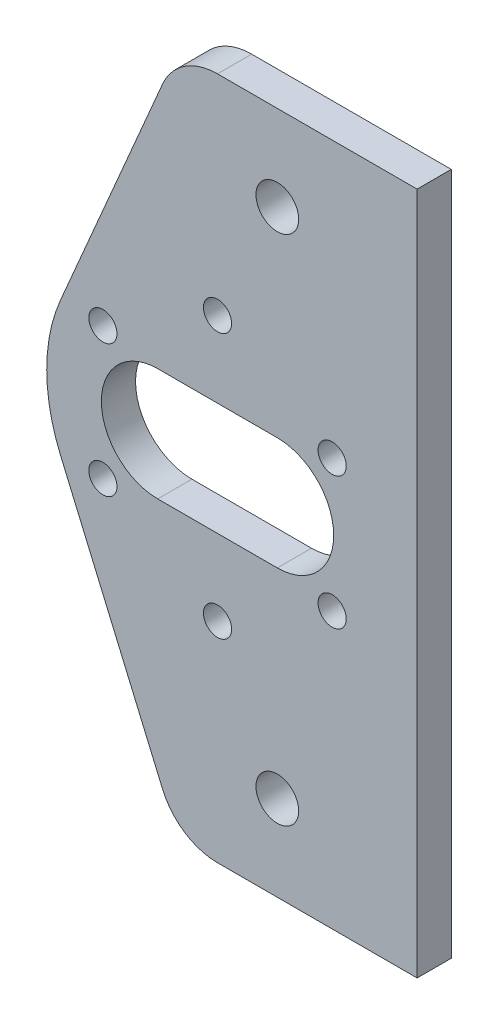
ISO-10303-21;
HEADER;
FILE_DESCRIPTION(('STEP AP214'),'2;1');
FILE_NAME('part.step','',(''),(''),'','','');
FILE_SCHEMA(('AUTOMOTIVE_DESIGN { 1 0 10303 214 1 1 1 1 }'));
ENDSEC;
DATA;
#1=APPLICATION_CONTEXT('core data for automotive mechanical design processes');
#2=APPLICATION_PROTOCOL_DEFINITION('international standard','automotive_design',2000,#1);
#3=PRODUCT_CONTEXT('',#1,'mechanical');
#4=PRODUCT('Part','Part','',(#3));
#5=PRODUCT_RELATED_PRODUCT_CATEGORY('part','',(#4));
#6=PRODUCT_DEFINITION_FORMATION('','',#4);
#7=PRODUCT_DEFINITION_CONTEXT('part definition',#1,'design');
#8=PRODUCT_DEFINITION('design','',#6,#7);
#9=PRODUCT_DEFINITION_SHAPE('','',#8);
#10=(LENGTH_UNIT() NAMED_UNIT(*) SI_UNIT(.MILLI.,.METRE.));
#11=(NAMED_UNIT(*) PLANE_ANGLE_UNIT() SI_UNIT($,.RADIAN.));
#12=(NAMED_UNIT(*) SI_UNIT($,.STERADIAN.) SOLID_ANGLE_UNIT());
#13=UNCERTAINTY_MEASURE_WITH_UNIT(LENGTH_MEASURE(1.E-05),#10,'distance_accuracy_value','');
#14=(GEOMETRIC_REPRESENTATION_CONTEXT(3) GLOBAL_UNCERTAINTY_ASSIGNED_CONTEXT((#13)) GLOBAL_UNIT_ASSIGNED_CONTEXT((#10,
#11,#12)) REPRESENTATION_CONTEXT('',''));
#15=CARTESIAN_POINT('',(0.,0.,0.));
#16=DIRECTION('',(0.,0.,1.));
#17=DIRECTION('',(1.,0.,0.));
#18=AXIS2_PLACEMENT_3D('',#15,#16,#17);
#19=CARTESIAN_POINT('',(-23.37,33.,2.));
#20=DIRECTION('',(0.,0.,-1.));
#21=DIRECTION('',(-1.,0.,0.));
#22=AXIS2_PLACEMENT_3D('',#19,#20,#21);
#23=PLANE('',#22);
#24=CARTESIAN_POINT('',(-9.94660624134121,7.75,2.));
#25=DIRECTION('',(0.,0.,1.));
#26=DIRECTION('',(1.,0.,0.));
#27=AXIS2_PLACEMENT_3D('',#24,#25,#26);
#28=CIRCLE('',#27,1.65000000000002);
#29=CARTESIAN_POINT('',(-8.29660624134119,7.75,2.));
#30=VERTEX_POINT('',#29);
#31=EDGE_CURVE('E344',#30,#30,#28,.T.);
#32=ORIENTED_EDGE('',*,*,#31,.F.);
#33=EDGE_LOOP('',(#32));
#34=FACE_BOUND('',#33,.T.);
#35=CARTESIAN_POINT('',(-30.37,0.,2.));
#36=DIRECTION('',(0.,0.,1.));
#37=DIRECTION('',(1.,0.,0.));
#38=AXIS2_PLACEMENT_3D('',#35,#36,#37);
#39=CIRCLE('',#38,6.59999999999999);
#40=CARTESIAN_POINT('',(-30.37,6.59999999999999,2.));
#41=VERTEX_POINT('',#40);
#42=CARTESIAN_POINT('',(-30.37,-6.59999999999999,2.));
#43=VERTEX_POINT('',#42);
#44=EDGE_CURVE('E128',#41,#43,#39,.T.);
#45=ORIENTED_EDGE('',*,*,#44,.F.);
#46=DIRECTION('',(-1.,0.,0.));
#47=VECTOR('',#46,1.);
#48=CARTESIAN_POINT('',(-30.37,6.59999999999999,2.));
#49=LINE('',#48,#47);
#50=CARTESIAN_POINT('',(-16.37,6.59999999999999,2.));
#51=VERTEX_POINT('',#50);
#52=EDGE_CURVE('E151',#51,#41,#49,.T.);
#53=ORIENTED_EDGE('',*,*,#52,.F.);
#54=CARTESIAN_POINT('',(-16.37,0.,2.));
#55=DIRECTION('',(0.,0.,1.));
#56=DIRECTION('',(1.,0.,0.));
#57=AXIS2_PLACEMENT_3D('',#54,#55,#56);
#58=CIRCLE('',#57,6.59999999999999);
#59=CARTESIAN_POINT('',(-16.37,-6.59999999999999,2.));
#60=VERTEX_POINT('',#59);
#61=EDGE_CURVE('E149',#60,#51,#58,.T.);
#62=ORIENTED_EDGE('',*,*,#61,.F.);
#63=DIRECTION('',(1.,0.,0.));
#64=VECTOR('',#63,1.);
#65=CARTESIAN_POINT('',(-30.37,-6.59999999999999,2.));
#66=LINE('',#65,#64);
#67=EDGE_CURVE('E136',#43,#60,#66,.T.);
#68=ORIENTED_EDGE('',*,*,#67,.F.);
#69=EDGE_LOOP('',(#45,#53,#62,#68));
#70=FACE_BOUND('',#69,.T.);
#71=CARTESIAN_POINT('',(-36.7933937586588,-7.74999999999999,2.));
#72=DIRECTION('',(0.,0.,1.));
#73=DIRECTION('',(1.,0.,0.));
#74=AXIS2_PLACEMENT_3D('',#71,#72,#73);
#75=CIRCLE('',#74,1.65000000000002);
#76=CARTESIAN_POINT('',(-35.1433937586588,-7.74999999999999,2.));
#77=VERTEX_POINT('',#76);
#78=EDGE_CURVE('E173',#77,#77,#75,.T.);
#79=ORIENTED_EDGE('',*,*,#78,.F.);
#80=EDGE_LOOP('',(#79));
#81=FACE_BOUND('',#80,.T.);
#82=CARTESIAN_POINT('',(-16.37,30.,2.));
#83=DIRECTION('',(0.,0.,1.));
#84=DIRECTION('',(1.,0.,0.));
#85=AXIS2_PLACEMENT_3D('',#82,#83,#84);
#86=CIRCLE('',#85,2.5);
#87=CARTESIAN_POINT('',(-13.87,30.,2.));
#88=VERTEX_POINT('',#87);
#89=EDGE_CURVE('E185',#88,#88,#86,.T.);
#90=ORIENTED_EDGE('',*,*,#89,.F.);
#91=EDGE_LOOP('',(#90));
#92=FACE_BOUND('',#91,.T.);
#93=DIRECTION('',(1.,0.,0.));
#94=VECTOR('',#93,1.);
#95=CARTESIAN_POINT('',(-23.37,-40.,2.));
#96=LINE('',#95,#94);
#97=CARTESIAN_POINT('',(-23.37,-40.,2.));
#98=VERTEX_POINT('',#97);
#99=CARTESIAN_POINT('',(0.,-40.,2.));
#100=VERTEX_POINT('',#99);
#101=EDGE_CURVE('E197',#98,#100,#96,.T.);
#102=ORIENTED_EDGE('',*,*,#101,.T.);
#103=DIRECTION('',(0.,1.,0.));
#104=VECTOR('',#103,1.);
#105=CARTESIAN_POINT('',(0.,-40.,2.));
#106=LINE('',#105,#104);
#107=CARTESIAN_POINT('',(0.,40.,2.));
#108=VERTEX_POINT('',#107);
#109=EDGE_CURVE('E200',#100,#108,#106,.T.);
#110=ORIENTED_EDGE('',*,*,#109,.T.);
#111=DIRECTION('',(-1.,0.,0.));
#112=VECTOR('',#111,1.);
#113=CARTESIAN_POINT('',(-23.37,40.,2.));
#114=LINE('',#113,#112);
#115=CARTESIAN_POINT('',(-23.37,40.,2.));
#116=VERTEX_POINT('',#115);
#117=EDGE_CURVE('E203',#108,#116,#114,.T.);
#118=ORIENTED_EDGE('',*,*,#117,.T.);
#119=CARTESIAN_POINT('',(-23.37,33.,2.));
#120=DIRECTION('',(0.,0.,1.));
#121=DIRECTION('',(-1.,0.,0.));
#122=AXIS2_PLACEMENT_3D('',#119,#120,#121);
#123=CIRCLE('',#122,7.);
#124=CARTESIAN_POINT('',(-29.8039549222256,35.7575757575758,2.));
#125=VERTEX_POINT('',#124);
#126=EDGE_CURVE('E205',#116,#125,#123,.T.);
#127=ORIENTED_EDGE('',*,*,#126,.T.);
#128=DIRECTION('',(-0.393939393939395,-0.919136417460794,0.));
#129=VECTOR('',#128,1.);
#130=CARTESIAN_POINT('',(-29.8039549222256,35.7575757575758,2.));
#131=LINE('',#130,#129);
#132=CARTESIAN_POINT('',(-41.7527283492159,7.87878787878789,2.));
#133=VERTEX_POINT('',#132);
#134=EDGE_CURVE('E207',#125,#133,#131,.T.);
#135=ORIENTED_EDGE('',*,*,#134,.T.);
#136=CARTESIAN_POINT('',(-23.37,0.,2.));
#137=DIRECTION('',(0.,0.,1.));
#138=DIRECTION('',(-1.,0.,0.));
#139=AXIS2_PLACEMENT_3D('',#136,#137,#138);
#140=CIRCLE('',#139,20.);
#141=CARTESIAN_POINT('',(-41.7527283492159,-7.87878787878789,2.));
#142=VERTEX_POINT('',#141);
#143=EDGE_CURVE('E209',#133,#142,#140,.T.);
#144=ORIENTED_EDGE('',*,*,#143,.T.);
#145=DIRECTION('',(0.393939393939395,-0.919136417460794,0.));
#146=VECTOR('',#145,1.);
#147=CARTESIAN_POINT('',(-41.7527283492159,-7.87878787878789,2.));
#148=LINE('',#147,#146);
#149=CARTESIAN_POINT('',(-29.8039549222256,-35.7575757575758,2.));
#150=VERTEX_POINT('',#149);
#151=EDGE_CURVE('E211',#142,#150,#148,.T.);
#152=ORIENTED_EDGE('',*,*,#151,.T.);
#153=CARTESIAN_POINT('',(-23.37,-33.,2.));
#154=DIRECTION('',(0.,0.,1.));
#155=DIRECTION('',(1.,0.,0.));
#156=AXIS2_PLACEMENT_3D('',#153,#154,#155);
#157=CIRCLE('',#156,7.);
#158=EDGE_CURVE('E213',#150,#98,#157,.T.);
#159=ORIENTED_EDGE('',*,*,#158,.T.);
#160=EDGE_LOOP('',(#102,#110,#118,#127,#135,#144,#152,#159));
#161=FACE_BOUND('',#160,.T.);
#162=CARTESIAN_POINT('',(-23.37,-15.5,2.));
#163=DIRECTION('',(0.,0.,1.));
#164=DIRECTION('',(1.,0.,0.));
#165=AXIS2_PLACEMENT_3D('',#162,#163,#164);
#166=CIRCLE('',#165,1.65000000000002);
#167=CARTESIAN_POINT('',(-21.72,-15.5,2.));
#168=VERTEX_POINT('',#167);
#169=EDGE_CURVE('E191',#168,#168,#166,.T.);
#170=ORIENTED_EDGE('',*,*,#169,.F.);
#171=EDGE_LOOP('',(#170));
#172=FACE_BOUND('',#171,.T.);
#173=CARTESIAN_POINT('',(-16.37,-30.,2.));
#174=DIRECTION('',(0.,0.,1.));
#175=DIRECTION('',(1.,0.,0.));
#176=AXIS2_PLACEMENT_3D('',#173,#174,#175);
#177=CIRCLE('',#176,2.50000000000002);
#178=CARTESIAN_POINT('',(-13.87,-30.,2.));
#179=VERTEX_POINT('',#178);
#180=EDGE_CURVE('E179',#179,#179,#177,.T.);
#181=ORIENTED_EDGE('',*,*,#180,.F.);
#182=EDGE_LOOP('',(#181));
#183=FACE_BOUND('',#182,.T.);
#184=CARTESIAN_POINT('',(-36.7933937586588,7.74999999999999,2.));
#185=DIRECTION('',(0.,0.,1.));
#186=DIRECTION('',(1.,0.,0.));
#187=AXIS2_PLACEMENT_3D('',#184,#185,#186);
#188=CIRCLE('',#187,1.65000000000002);
#189=CARTESIAN_POINT('',(-35.1433937586588,7.74999999999999,2.));
#190=VERTEX_POINT('',#189);
#191=EDGE_CURVE('E167',#190,#190,#188,.T.);
#192=ORIENTED_EDGE('',*,*,#191,.F.);
#193=EDGE_LOOP('',(#192));
#194=FACE_BOUND('',#193,.T.);
#195=CARTESIAN_POINT('',(-23.37,15.5,2.));
#196=DIRECTION('',(0.,0.,1.));
#197=DIRECTION('',(1.,0.,0.));
#198=AXIS2_PLACEMENT_3D('',#195,#196,#197);
#199=CIRCLE('',#198,1.65000000000002);
#200=CARTESIAN_POINT('',(-21.72,15.5,2.));
#201=VERTEX_POINT('',#200);
#202=EDGE_CURVE('E157',#201,#201,#199,.T.);
#203=ORIENTED_EDGE('',*,*,#202,.F.);
#204=EDGE_LOOP('',(#203));
#205=FACE_BOUND('',#204,.T.);
#206=CARTESIAN_POINT('',(-9.94660624134121,-7.74999999999999,2.));
#207=DIRECTION('',(0.,0.,1.));
#208=DIRECTION('',(1.,0.,0.));
#209=AXIS2_PLACEMENT_3D('',#206,#207,#208);
#210=CIRCLE('',#209,1.65000000000002);
#211=CARTESIAN_POINT('',(-8.29660624134119,-7.74999999999999,2.));
#212=VERTEX_POINT('',#211);
#213=EDGE_CURVE('E338',#212,#212,#210,.T.);
#214=ORIENTED_EDGE('',*,*,#213,.F.);
#215=EDGE_LOOP('',(#214));
#216=FACE_BOUND('',#215,.T.);
#217=ADVANCED_FACE('F39',(#34,#70,#81,#92,#161,#172,#183,#194,#205,#216),#23,.F.);
#218=CARTESIAN_POINT('',(-23.37,33.,-2.));
#219=DIRECTION('',(0.,0.,-1.));
#220=DIRECTION('',(-1.,0.,0.));
#221=AXIS2_PLACEMENT_3D('',#218,#219,#220);
#222=PLANE('',#221);
#223=CARTESIAN_POINT('',(-9.94660624134121,7.75,-2.));
#224=DIRECTION('',(0.,0.,1.));
#225=DIRECTION('',(1.,0.,0.));
#226=AXIS2_PLACEMENT_3D('',#223,#224,#225);
#227=CIRCLE('',#226,1.65000000000002);
#228=CARTESIAN_POINT('',(-8.29660624134119,7.75,-2.));
#229=VERTEX_POINT('',#228);
#230=EDGE_CURVE('E341',#229,#229,#227,.T.);
#231=ORIENTED_EDGE('',*,*,#230,.T.);
#232=EDGE_LOOP('',(#231));
#233=FACE_BOUND('',#232,.T.);
#234=DIRECTION('',(-1.,0.,0.));
#235=VECTOR('',#234,1.);
#236=CARTESIAN_POINT('',(-30.37,6.59999999999999,-2.));
#237=LINE('',#236,#235);
#238=CARTESIAN_POINT('',(-16.37,6.59999999999999,-2.));
#239=VERTEX_POINT('',#238);
#240=CARTESIAN_POINT('',(-30.37,6.59999999999999,-2.));
#241=VERTEX_POINT('',#240);
#242=EDGE_CURVE('E137',#239,#241,#237,.T.);
#243=ORIENTED_EDGE('',*,*,#242,.T.);
#244=CARTESIAN_POINT('',(-30.37,0.,-2.));
#245=DIRECTION('',(0.,0.,1.));
#246=DIRECTION('',(1.,0.,0.));
#247=AXIS2_PLACEMENT_3D('',#244,#245,#246);
#248=CIRCLE('',#247,6.59999999999999);
#249=CARTESIAN_POINT('',(-30.37,-6.59999999999999,-2.));
#250=VERTEX_POINT('',#249);
#251=EDGE_CURVE('E62',#241,#250,#248,.T.);
#252=ORIENTED_EDGE('',*,*,#251,.T.);
#253=DIRECTION('',(1.,0.,0.));
#254=VECTOR('',#253,1.);
#255=CARTESIAN_POINT('',(-30.37,-6.59999999999999,-2.));
#256=LINE('',#255,#254);
#257=CARTESIAN_POINT('',(-16.37,-6.59999999999999,-2.));
#258=VERTEX_POINT('',#257);
#259=EDGE_CURVE('E143',#250,#258,#256,.T.);
#260=ORIENTED_EDGE('',*,*,#259,.T.);
#261=CARTESIAN_POINT('',(-16.37,0.,-2.));
#262=DIRECTION('',(0.,0.,1.));
#263=DIRECTION('',(1.,0.,0.));
#264=AXIS2_PLACEMENT_3D('',#261,#262,#263);
#265=CIRCLE('',#264,6.59999999999999);
#266=EDGE_CURVE('E159',#258,#239,#265,.T.);
#267=ORIENTED_EDGE('',*,*,#266,.T.);
#268=EDGE_LOOP('',(#243,#252,#260,#267));
#269=FACE_BOUND('',#268,.T.);
#270=CARTESIAN_POINT('',(-36.7933937586588,-7.74999999999999,-2.));
#271=DIRECTION('',(0.,0.,1.));
#272=DIRECTION('',(1.,0.,0.));
#273=AXIS2_PLACEMENT_3D('',#270,#271,#272);
#274=CIRCLE('',#273,1.65000000000002);
#275=CARTESIAN_POINT('',(-35.1433937586588,-7.74999999999999,-2.));
#276=VERTEX_POINT('',#275);
#277=EDGE_CURVE('E170',#276,#276,#274,.T.);
#278=ORIENTED_EDGE('',*,*,#277,.T.);
#279=EDGE_LOOP('',(#278));
#280=FACE_BOUND('',#279,.T.);
#281=CARTESIAN_POINT('',(-16.37,30.,-2.));
#282=DIRECTION('',(0.,0.,1.));
#283=DIRECTION('',(1.,0.,0.));
#284=AXIS2_PLACEMENT_3D('',#281,#282,#283);
#285=CIRCLE('',#284,2.5);
#286=CARTESIAN_POINT('',(-13.87,30.,-2.));
#287=VERTEX_POINT('',#286);
#288=EDGE_CURVE('E182',#287,#287,#285,.T.);
#289=ORIENTED_EDGE('',*,*,#288,.T.);
#290=EDGE_LOOP('',(#289));
#291=FACE_BOUND('',#290,.T.);
#292=DIRECTION('',(1.,0.,0.));
#293=VECTOR('',#292,1.);
#294=CARTESIAN_POINT('',(-23.37,-40.,-2.));
#295=LINE('',#294,#293);
#296=CARTESIAN_POINT('',(-23.37,-40.,-2.));
#297=VERTEX_POINT('',#296);
#298=CARTESIAN_POINT('',(0.,-40.,-2.));
#299=VERTEX_POINT('',#298);
#300=EDGE_CURVE('E194',#297,#299,#295,.T.);
#301=ORIENTED_EDGE('',*,*,#300,.F.);
#302=CARTESIAN_POINT('',(-23.37,-33.,-2.));
#303=DIRECTION('',(0.,0.,1.));
#304=DIRECTION('',(1.,0.,0.));
#305=AXIS2_PLACEMENT_3D('',#302,#303,#304);
#306=CIRCLE('',#305,7.);
#307=CARTESIAN_POINT('',(-29.8039549222256,-35.7575757575758,-2.));
#308=VERTEX_POINT('',#307);
#309=EDGE_CURVE('E201',#308,#297,#306,.T.);
#310=ORIENTED_EDGE('',*,*,#309,.F.);
#311=DIRECTION('',(0.393939393939395,-0.919136417460794,0.));
#312=VECTOR('',#311,1.);
#313=CARTESIAN_POINT('',(-41.7527283492159,-7.87878787878789,-2.));
#314=LINE('',#313,#312);
#315=CARTESIAN_POINT('',(-41.7527283492159,-7.87878787878789,-2.));
#316=VERTEX_POINT('',#315);
#317=EDGE_CURVE('E228',#316,#308,#314,.T.);
#318=ORIENTED_EDGE('',*,*,#317,.F.);
#319=CARTESIAN_POINT('',(-23.37,0.,-2.));
#320=DIRECTION('',(0.,0.,1.));
#321=DIRECTION('',(-1.,0.,0.));
#322=AXIS2_PLACEMENT_3D('',#319,#320,#321);
#323=CIRCLE('',#322,20.);
#324=CARTESIAN_POINT('',(-41.7527283492159,7.87878787878789,-2.));
#325=VERTEX_POINT('',#324);
#326=EDGE_CURVE('E226',#325,#316,#323,.T.);
#327=ORIENTED_EDGE('',*,*,#326,.F.);
#328=DIRECTION('',(-0.393939393939395,-0.919136417460794,0.));
#329=VECTOR('',#328,1.);
#330=CARTESIAN_POINT('',(-29.8039549222256,35.7575757575758,-2.));
#331=LINE('',#330,#329);
#332=CARTESIAN_POINT('',(-29.8039549222256,35.7575757575758,-2.));
#333=VERTEX_POINT('',#332);
#334=EDGE_CURVE('E224',#333,#325,#331,.T.);
#335=ORIENTED_EDGE('',*,*,#334,.F.);
#336=CARTESIAN_POINT('',(-23.37,33.,-2.));
#337=DIRECTION('',(0.,0.,1.));
#338=DIRECTION('',(-1.,0.,0.));
#339=AXIS2_PLACEMENT_3D('',#336,#337,#338);
#340=CIRCLE('',#339,7.);
#341=CARTESIAN_POINT('',(-23.37,40.,-2.));
#342=VERTEX_POINT('',#341);
#343=EDGE_CURVE('E222',#342,#333,#340,.T.);
#344=ORIENTED_EDGE('',*,*,#343,.F.);
#345=DIRECTION('',(-1.,0.,0.));
#346=VECTOR('',#345,1.);
#347=CARTESIAN_POINT('',(-23.37,40.,-2.));
#348=LINE('',#347,#346);
#349=CARTESIAN_POINT('',(0.,40.,-2.));
#350=VERTEX_POINT('',#349);
#351=EDGE_CURVE('E220',#350,#342,#348,.T.);
#352=ORIENTED_EDGE('',*,*,#351,.F.);
#353=DIRECTION('',(0.,1.,0.));
#354=VECTOR('',#353,1.);
#355=CARTESIAN_POINT('',(0.,-40.,-2.));
#356=LINE('',#355,#354);
#357=EDGE_CURVE('E218',#299,#350,#356,.T.);
#358=ORIENTED_EDGE('',*,*,#357,.F.);
#359=EDGE_LOOP('',(#301,#310,#318,#327,#335,#344,#352,#358));
#360=FACE_BOUND('',#359,.T.);
#361=CARTESIAN_POINT('',(-23.37,-15.5,-2.));
#362=DIRECTION('',(0.,0.,1.));
#363=DIRECTION('',(1.,0.,0.));
#364=AXIS2_PLACEMENT_3D('',#361,#362,#363);
#365=CIRCLE('',#364,1.65000000000002);
#366=CARTESIAN_POINT('',(-21.72,-15.5,-2.));
#367=VERTEX_POINT('',#366);
#368=EDGE_CURVE('E188',#367,#367,#365,.T.);
#369=ORIENTED_EDGE('',*,*,#368,.T.);
#370=EDGE_LOOP('',(#369));
#371=FACE_BOUND('',#370,.T.);
#372=CARTESIAN_POINT('',(-16.37,-30.,-2.));
#373=DIRECTION('',(0.,0.,1.));
#374=DIRECTION('',(1.,0.,0.));
#375=AXIS2_PLACEMENT_3D('',#372,#373,#374);
#376=CIRCLE('',#375,2.50000000000002);
#377=CARTESIAN_POINT('',(-13.87,-30.,-2.));
#378=VERTEX_POINT('',#377);
#379=EDGE_CURVE('E176',#378,#378,#376,.T.);
#380=ORIENTED_EDGE('',*,*,#379,.T.);
#381=EDGE_LOOP('',(#380));
#382=FACE_BOUND('',#381,.T.);
#383=CARTESIAN_POINT('',(-36.7933937586588,7.74999999999999,-2.));
#384=DIRECTION('',(0.,0.,1.));
#385=DIRECTION('',(1.,0.,0.));
#386=AXIS2_PLACEMENT_3D('',#383,#384,#385);
#387=CIRCLE('',#386,1.65000000000002);
#388=CARTESIAN_POINT('',(-35.1433937586588,7.74999999999999,-2.));
#389=VERTEX_POINT('',#388);
#390=EDGE_CURVE('E144',#389,#389,#387,.T.);
#391=ORIENTED_EDGE('',*,*,#390,.T.);
#392=EDGE_LOOP('',(#391));
#393=FACE_BOUND('',#392,.T.);
#394=CARTESIAN_POINT('',(-23.37,15.5,-2.));
#395=DIRECTION('',(0.,0.,1.));
#396=DIRECTION('',(1.,0.,0.));
#397=AXIS2_PLACEMENT_3D('',#394,#395,#396);
#398=CIRCLE('',#397,1.65000000000002);
#399=CARTESIAN_POINT('',(-21.72,15.5,-2.));
#400=VERTEX_POINT('',#399);
#401=EDGE_CURVE('E333',#400,#400,#398,.T.);
#402=ORIENTED_EDGE('',*,*,#401,.T.);
#403=EDGE_LOOP('',(#402));
#404=FACE_BOUND('',#403,.T.);
#405=CARTESIAN_POINT('',(-9.94660624134121,-7.74999999999999,-2.));
#406=DIRECTION('',(0.,0.,1.));
#407=DIRECTION('',(1.,0.,0.));
#408=AXIS2_PLACEMENT_3D('',#405,#406,#407);
#409=CIRCLE('',#408,1.65000000000002);
#410=CARTESIAN_POINT('',(-8.29660624134119,-7.74999999999999,-2.));
#411=VERTEX_POINT('',#410);
#412=EDGE_CURVE('E336',#411,#411,#409,.T.);
#413=ORIENTED_EDGE('',*,*,#412,.T.);
#414=EDGE_LOOP('',(#413));
#415=FACE_BOUND('',#414,.T.);
#416=ADVANCED_FACE('F258',(#233,#269,#280,#291,#360,#371,#382,#393,#404,#415),#222,.T.);
#417=CARTESIAN_POINT('',(-23.37,-40.,2.));
#418=DIRECTION('',(0.,1.,0.));
#419=DIRECTION('',(0.,0.,1.));
#420=AXIS2_PLACEMENT_3D('',#417,#418,#419);
#421=PLANE('',#420);
#422=ORIENTED_EDGE('',*,*,#300,.T.);
#423=DIRECTION('',(0.,0.,-1.));
#424=VECTOR('',#423,1.);
#425=CARTESIAN_POINT('',(0.,-40.,2.));
#426=LINE('',#425,#424);
#427=EDGE_CURVE('E11',#100,#299,#426,.T.);
#428=ORIENTED_EDGE('',*,*,#427,.F.);
#429=ORIENTED_EDGE('',*,*,#101,.F.);
#430=DIRECTION('',(0.,0.,-1.));
#431=VECTOR('',#430,1.);
#432=CARTESIAN_POINT('',(-23.37,-40.,2.));
#433=LINE('',#432,#431);
#434=EDGE_CURVE('E215',#98,#297,#433,.T.);
#435=ORIENTED_EDGE('',*,*,#434,.T.);
#436=EDGE_LOOP('',(#422,#428,#429,#435));
#437=FACE_BOUND('',#436,.T.);
#438=ADVANCED_FACE('F41',(#437),#421,.F.);
#439=CARTESIAN_POINT('',(0.,-40.,2.));
#440=DIRECTION('',(-1.,0.,0.));
#441=DIRECTION('',(0.,0.,1.));
#442=AXIS2_PLACEMENT_3D('',#439,#440,#441);
#443=PLANE('',#442);
#444=ORIENTED_EDGE('',*,*,#357,.T.);
#445=DIRECTION('',(0.,0.,-1.));
#446=VECTOR('',#445,1.);
#447=CARTESIAN_POINT('',(0.,40.,2.));
#448=LINE('',#447,#446);
#449=EDGE_CURVE('E47',#108,#350,#448,.T.);
#450=ORIENTED_EDGE('',*,*,#449,.F.);
#451=ORIENTED_EDGE('',*,*,#109,.F.);
#452=ORIENTED_EDGE('',*,*,#427,.T.);
#453=EDGE_LOOP('',(#444,#450,#451,#452));
#454=FACE_BOUND('',#453,.T.);
#455=ADVANCED_FACE('F276',(#454),#443,.F.);
#456=CARTESIAN_POINT('',(-23.37,40.,2.));
#457=DIRECTION('',(0.,-1.,0.));
#458=DIRECTION('',(0.,0.,-1.));
#459=AXIS2_PLACEMENT_3D('',#456,#457,#458);
#460=PLANE('',#459);
#461=ORIENTED_EDGE('',*,*,#351,.T.);
#462=DIRECTION('',(0.,0.,-1.));
#463=VECTOR('',#462,1.);
#464=CARTESIAN_POINT('',(-23.37,40.,2.));
#465=LINE('',#464,#463);
#466=EDGE_CURVE('E245',#116,#342,#465,.T.);
#467=ORIENTED_EDGE('',*,*,#466,.F.);
#468=ORIENTED_EDGE('',*,*,#117,.F.);
#469=ORIENTED_EDGE('',*,*,#449,.T.);
#470=EDGE_LOOP('',(#461,#467,#468,#469));
#471=FACE_BOUND('',#470,.T.);
#472=ADVANCED_FACE('F252',(#471),#460,.F.);
#473=CARTESIAN_POINT('',(-23.37,33.,2.));
#474=DIRECTION('',(0.,0.,-1.));
#475=DIRECTION('',(-1.,0.,0.));
#476=AXIS2_PLACEMENT_3D('',#473,#474,#475);
#477=CYLINDRICAL_SURFACE('',#476,7.);
#478=ORIENTED_EDGE('',*,*,#343,.T.);
#479=DIRECTION('',(0.,0.,-1.));
#480=VECTOR('',#479,1.);
#481=CARTESIAN_POINT('',(-29.8039549222256,35.7575757575758,2.));
#482=LINE('',#481,#480);
#483=EDGE_CURVE('E242',#125,#333,#482,.T.);
#484=ORIENTED_EDGE('',*,*,#483,.F.);
#485=ORIENTED_EDGE('',*,*,#126,.F.);
#486=ORIENTED_EDGE('',*,*,#466,.T.);
#487=EDGE_LOOP('',(#478,#484,#485,#486));
#488=FACE_BOUND('',#487,.T.);
#489=ADVANCED_FACE('F264',(#488),#477,.T.);
#490=CARTESIAN_POINT('',(-29.8039549222256,35.7575757575758,2.));
#491=DIRECTION('',(0.919136417460794,-0.393939393939395,0.));
#492=DIRECTION('',(0.393939393939395,0.919136417460794,0.));
#493=AXIS2_PLACEMENT_3D('',#490,#491,#492);
#494=PLANE('',#493);
#495=ORIENTED_EDGE('',*,*,#334,.T.);
#496=DIRECTION('',(0.,0.,-1.));
#497=VECTOR('',#496,1.);
#498=CARTESIAN_POINT('',(-41.7527283492159,7.87878787878789,2.));
#499=LINE('',#498,#497);
#500=EDGE_CURVE('E239',#133,#325,#499,.T.);
#501=ORIENTED_EDGE('',*,*,#500,.F.);
#502=ORIENTED_EDGE('',*,*,#134,.F.);
#503=ORIENTED_EDGE('',*,*,#483,.T.);
#504=EDGE_LOOP('',(#495,#501,#502,#503));
#505=FACE_BOUND('',#504,.T.);
#506=ADVANCED_FACE('F268',(#505),#494,.F.);
#507=CARTESIAN_POINT('',(-23.37,0.,2.));
#508=DIRECTION('',(0.,0.,-1.));
#509=DIRECTION('',(-1.,0.,0.));
#510=AXIS2_PLACEMENT_3D('',#507,#508,#509);
#511=CYLINDRICAL_SURFACE('',#510,20.);
#512=ORIENTED_EDGE('',*,*,#326,.T.);
#513=DIRECTION('',(0.,0.,-1.));
#514=VECTOR('',#513,1.);
#515=CARTESIAN_POINT('',(-41.7527283492159,-7.87878787878789,2.));
#516=LINE('',#515,#514);
#517=EDGE_CURVE('E236',#142,#316,#516,.T.);
#518=ORIENTED_EDGE('',*,*,#517,.F.);
#519=ORIENTED_EDGE('',*,*,#143,.F.);
#520=ORIENTED_EDGE('',*,*,#500,.T.);
#521=EDGE_LOOP('',(#512,#518,#519,#520));
#522=FACE_BOUND('',#521,.T.);
#523=ADVANCED_FACE('F289',(#522),#511,.T.);
#524=CARTESIAN_POINT('',(-41.7527283492159,-7.87878787878789,2.));
#525=DIRECTION('',(0.919136417460794,0.393939393939395,0.));
#526=DIRECTION('',(-0.393939393939395,0.919136417460794,0.));
#527=AXIS2_PLACEMENT_3D('',#524,#525,#526);
#528=PLANE('',#527);
#529=ORIENTED_EDGE('',*,*,#317,.T.);
#530=DIRECTION('',(0.,0.,-1.));
#531=VECTOR('',#530,1.);
#532=CARTESIAN_POINT('',(-29.8039549222256,-35.7575757575758,2.));
#533=LINE('',#532,#531);
#534=EDGE_CURVE('E233',#150,#308,#533,.T.);
#535=ORIENTED_EDGE('',*,*,#534,.F.);
#536=ORIENTED_EDGE('',*,*,#151,.F.);
#537=ORIENTED_EDGE('',*,*,#517,.T.);
#538=EDGE_LOOP('',(#529,#535,#536,#537));
#539=FACE_BOUND('',#538,.T.);
#540=ADVANCED_FACE('F287',(#539),#528,.F.);
#541=CARTESIAN_POINT('',(-23.37,-33.,2.));
#542=DIRECTION('',(0.,0.,-1.));
#543=DIRECTION('',(-1.,0.,0.));
#544=AXIS2_PLACEMENT_3D('',#541,#542,#543);
#545=CYLINDRICAL_SURFACE('',#544,7.);
#546=ORIENTED_EDGE('',*,*,#309,.T.);
#547=ORIENTED_EDGE('',*,*,#434,.F.);
#548=ORIENTED_EDGE('',*,*,#158,.F.);
#549=ORIENTED_EDGE('',*,*,#534,.T.);
#550=EDGE_LOOP('',(#546,#547,#548,#549));
#551=FACE_BOUND('',#550,.T.);
#552=ADVANCED_FACE('F282',(#551),#545,.T.);
#553=CARTESIAN_POINT('',(-23.37,-15.5,2.));
#554=DIRECTION('',(0.,0.,-1.));
#555=DIRECTION('',(-1.,0.,0.));
#556=AXIS2_PLACEMENT_3D('',#553,#554,#555);
#557=CYLINDRICAL_SURFACE('',#556,1.65000000000002);
#558=ORIENTED_EDGE('',*,*,#169,.T.);
#559=EDGE_LOOP('',(#558));
#560=FACE_BOUND('',#559,.T.);
#561=ORIENTED_EDGE('',*,*,#368,.F.);
#562=EDGE_LOOP('',(#561));
#563=FACE_BOUND('',#562,.T.);
#564=ADVANCED_FACE('F308',(#560,#563),#557,.F.);
#565=CARTESIAN_POINT('',(-16.37,30.,2.));
#566=DIRECTION('',(0.,0.,-1.));
#567=DIRECTION('',(-1.,0.,0.));
#568=AXIS2_PLACEMENT_3D('',#565,#566,#567);
#569=CYLINDRICAL_SURFACE('',#568,2.5);
#570=ORIENTED_EDGE('',*,*,#89,.T.);
#571=EDGE_LOOP('',(#570));
#572=FACE_BOUND('',#571,.T.);
#573=ORIENTED_EDGE('',*,*,#288,.F.);
#574=EDGE_LOOP('',(#573));
#575=FACE_BOUND('',#574,.T.);
#576=ADVANCED_FACE('F315',(#572,#575),#569,.F.);
#577=CARTESIAN_POINT('',(-16.37,-30.,2.));
#578=DIRECTION('',(0.,0.,-1.));
#579=DIRECTION('',(-1.,0.,0.));
#580=AXIS2_PLACEMENT_3D('',#577,#578,#579);
#581=CYLINDRICAL_SURFACE('',#580,2.50000000000002);
#582=ORIENTED_EDGE('',*,*,#180,.T.);
#583=EDGE_LOOP('',(#582));
#584=FACE_BOUND('',#583,.T.);
#585=ORIENTED_EDGE('',*,*,#379,.F.);
#586=EDGE_LOOP('',(#585));
#587=FACE_BOUND('',#586,.T.);
#588=ADVANCED_FACE('F320',(#584,#587),#581,.F.);
#589=CARTESIAN_POINT('',(-36.7933937586588,-7.74999999999999,2.));
#590=DIRECTION('',(0.,0.,-1.));
#591=DIRECTION('',(-1.,0.,0.));
#592=AXIS2_PLACEMENT_3D('',#589,#590,#591);
#593=CYLINDRICAL_SURFACE('',#592,1.65000000000002);
#594=ORIENTED_EDGE('',*,*,#78,.T.);
#595=EDGE_LOOP('',(#594));
#596=FACE_BOUND('',#595,.T.);
#597=ORIENTED_EDGE('',*,*,#277,.F.);
#598=EDGE_LOOP('',(#597));
#599=FACE_BOUND('',#598,.T.);
#600=ADVANCED_FACE('F384',(#596,#599),#593,.F.);
#601=CARTESIAN_POINT('',(-36.7933937586588,7.74999999999999,2.));
#602=DIRECTION('',(0.,0.,-1.));
#603=DIRECTION('',(-1.,0.,0.));
#604=AXIS2_PLACEMENT_3D('',#601,#602,#603);
#605=CYLINDRICAL_SURFACE('',#604,1.65000000000002);
#606=ORIENTED_EDGE('',*,*,#191,.T.);
#607=EDGE_LOOP('',(#606));
#608=FACE_BOUND('',#607,.T.);
#609=ORIENTED_EDGE('',*,*,#390,.F.);
#610=EDGE_LOOP('',(#609));
#611=FACE_BOUND('',#610,.T.);
#612=ADVANCED_FACE('F381',(#608,#611),#605,.F.);
#613=CARTESIAN_POINT('',(-30.37,0.,2.));
#614=DIRECTION('',(0.,0.,-1.));
#615=DIRECTION('',(-1.,0.,0.));
#616=AXIS2_PLACEMENT_3D('',#613,#614,#615);
#617=CYLINDRICAL_SURFACE('',#616,6.59999999999999);
#618=ORIENTED_EDGE('',*,*,#251,.F.);
#619=DIRECTION('',(0.,0.,-1.));
#620=VECTOR('',#619,1.);
#621=CARTESIAN_POINT('',(-30.37,6.59999999999999,2.));
#622=LINE('',#621,#620);
#623=EDGE_CURVE('E132',#41,#241,#622,.T.);
#624=ORIENTED_EDGE('',*,*,#623,.F.);
#625=ORIENTED_EDGE('',*,*,#44,.T.);
#626=DIRECTION('',(0.,0.,-1.));
#627=VECTOR('',#626,1.);
#628=CARTESIAN_POINT('',(-30.37,-6.59999999999999,2.));
#629=LINE('',#628,#627);
#630=EDGE_CURVE('E131',#43,#250,#629,.T.);
#631=ORIENTED_EDGE('',*,*,#630,.T.);
#632=EDGE_LOOP('',(#618,#624,#625,#631));
#633=FACE_BOUND('',#632,.T.);
#634=ADVANCED_FACE('F130',(#633),#617,.F.);
#635=CARTESIAN_POINT('',(-30.37,-6.59999999999999,2.));
#636=DIRECTION('',(0.,1.,0.));
#637=DIRECTION('',(0.,0.,1.));
#638=AXIS2_PLACEMENT_3D('',#635,#636,#637);
#639=PLANE('',#638);
#640=ORIENTED_EDGE('',*,*,#259,.F.);
#641=ORIENTED_EDGE('',*,*,#630,.F.);
#642=ORIENTED_EDGE('',*,*,#67,.T.);
#643=DIRECTION('',(0.,0.,-1.));
#644=VECTOR('',#643,1.);
#645=CARTESIAN_POINT('',(-16.37,-6.59999999999999,2.));
#646=LINE('',#645,#644);
#647=EDGE_CURVE('E145',#60,#258,#646,.T.);
#648=ORIENTED_EDGE('',*,*,#647,.T.);
#649=EDGE_LOOP('',(#640,#641,#642,#648));
#650=FACE_BOUND('',#649,.T.);
#651=ADVANCED_FACE('F140',(#650),#639,.T.);
#652=CARTESIAN_POINT('',(-16.37,0.,2.));
#653=DIRECTION('',(0.,0.,-1.));
#654=DIRECTION('',(-1.,0.,0.));
#655=AXIS2_PLACEMENT_3D('',#652,#653,#654);
#656=CYLINDRICAL_SURFACE('',#655,6.59999999999999);
#657=ORIENTED_EDGE('',*,*,#266,.F.);
#658=ORIENTED_EDGE('',*,*,#647,.F.);
#659=ORIENTED_EDGE('',*,*,#61,.T.);
#660=DIRECTION('',(0.,0.,-1.));
#661=VECTOR('',#660,1.);
#662=CARTESIAN_POINT('',(-16.37,6.59999999999999,2.));
#663=LINE('',#662,#661);
#664=EDGE_CURVE('E54',#51,#239,#663,.T.);
#665=ORIENTED_EDGE('',*,*,#664,.T.);
#666=EDGE_LOOP('',(#657,#658,#659,#665));
#667=FACE_BOUND('',#666,.T.);
#668=ADVANCED_FACE('F373',(#667),#656,.F.);
#669=CARTESIAN_POINT('',(-30.37,6.59999999999999,2.));
#670=DIRECTION('',(0.,-1.,0.));
#671=DIRECTION('',(0.,0.,-1.));
#672=AXIS2_PLACEMENT_3D('',#669,#670,#671);
#673=PLANE('',#672);
#674=ORIENTED_EDGE('',*,*,#242,.F.);
#675=ORIENTED_EDGE('',*,*,#664,.F.);
#676=ORIENTED_EDGE('',*,*,#52,.T.);
#677=ORIENTED_EDGE('',*,*,#623,.T.);
#678=EDGE_LOOP('',(#674,#675,#676,#677));
#679=FACE_BOUND('',#678,.T.);
#680=ADVANCED_FACE('F370',(#679),#673,.T.);
#681=CARTESIAN_POINT('',(-23.37,15.5,2.));
#682=DIRECTION('',(0.,0.,-1.));
#683=DIRECTION('',(-1.,0.,0.));
#684=AXIS2_PLACEMENT_3D('',#681,#682,#683);
#685=CYLINDRICAL_SURFACE('',#684,1.65000000000002);
#686=ORIENTED_EDGE('',*,*,#202,.T.);
#687=EDGE_LOOP('',(#686));
#688=FACE_BOUND('',#687,.T.);
#689=ORIENTED_EDGE('',*,*,#401,.F.);
#690=EDGE_LOOP('',(#689));
#691=FACE_BOUND('',#690,.T.);
#692=ADVANCED_FACE('F352',(#688,#691),#685,.F.);
#693=CARTESIAN_POINT('',(-9.94660624134121,7.75,2.));
#694=DIRECTION('',(0.,0.,-1.));
#695=DIRECTION('',(-1.,0.,0.));
#696=AXIS2_PLACEMENT_3D('',#693,#694,#695);
#697=CYLINDRICAL_SURFACE('',#696,1.65000000000002);
#698=ORIENTED_EDGE('',*,*,#31,.T.);
#699=EDGE_LOOP('',(#698));
#700=FACE_BOUND('',#699,.T.);
#701=ORIENTED_EDGE('',*,*,#230,.F.);
#702=EDGE_LOOP('',(#701));
#703=FACE_BOUND('',#702,.T.);
#704=ADVANCED_FACE('F360',(#700,#703),#697,.F.);
#705=CARTESIAN_POINT('',(-9.94660624134121,-7.74999999999999,2.));
#706=DIRECTION('',(0.,0.,-1.));
#707=DIRECTION('',(-1.,0.,0.));
#708=AXIS2_PLACEMENT_3D('',#705,#706,#707);
#709=CYLINDRICAL_SURFACE('',#708,1.65000000000002);
#710=ORIENTED_EDGE('',*,*,#213,.T.);
#711=EDGE_LOOP('',(#710));
#712=FACE_BOUND('',#711,.T.);
#713=ORIENTED_EDGE('',*,*,#412,.F.);
#714=EDGE_LOOP('',(#713));
#715=FACE_BOUND('',#714,.T.);
#716=ADVANCED_FACE('F358',(#712,#715),#709,.F.);
#717=CLOSED_SHELL('',(#217,#416,#438,#455,#472,#489,#506,#523,#540,#552,#564,#576,#588,#600,
#612,#634,#651,#668,#680,#692,#704,#716));
#718=MANIFOLD_SOLID_BREP('B2',#717);
#719=ADVANCED_BREP_SHAPE_REPRESENTATION('',(#18,#718),#14);
#720=SHAPE_DEFINITION_REPRESENTATION(#9,#719);
ENDSEC;
END-ISO-10303-21;
